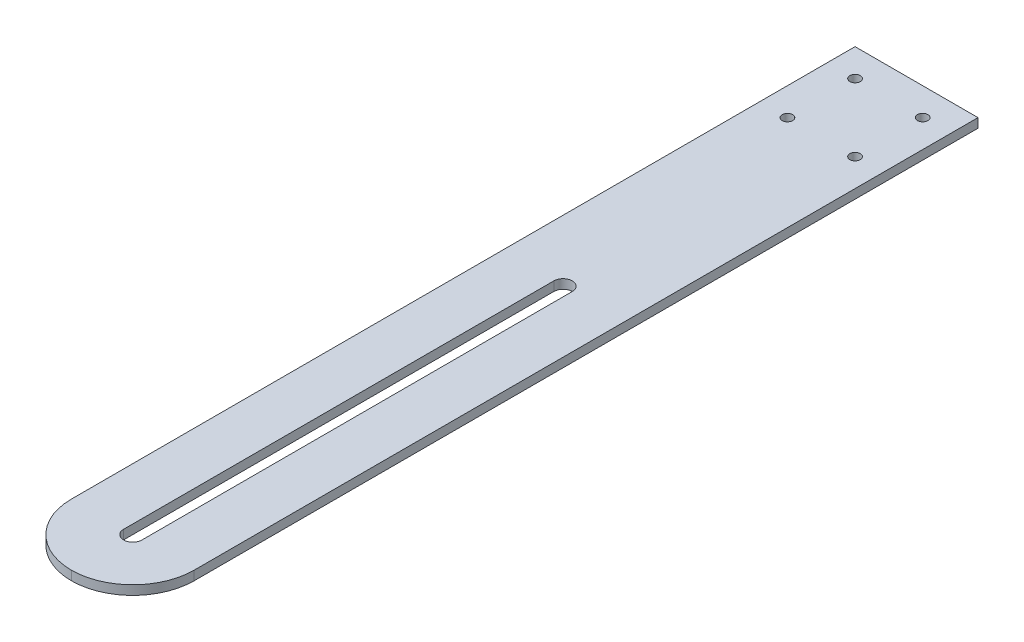
ISO-10303-21;
HEADER;
FILE_DESCRIPTION(('STEP AP214'),'2;1');
FILE_NAME('part.step','',(''),(''),'','','');
FILE_SCHEMA(('AUTOMOTIVE_DESIGN { 1 0 10303 214 1 1 1 1 }'));
ENDSEC;
DATA;
#1=APPLICATION_CONTEXT('core data for automotive mechanical design processes');
#2=APPLICATION_PROTOCOL_DEFINITION('international standard','automotive_design',2000,#1);
#3=PRODUCT_CONTEXT('',#1,'mechanical');
#4=PRODUCT('Part','Part','',(#3));
#5=PRODUCT_RELATED_PRODUCT_CATEGORY('part','',(#4));
#6=PRODUCT_DEFINITION_FORMATION('','',#4);
#7=PRODUCT_DEFINITION_CONTEXT('part definition',#1,'design');
#8=PRODUCT_DEFINITION('design','',#6,#7);
#9=PRODUCT_DEFINITION_SHAPE('','',#8);
#10=(LENGTH_UNIT() NAMED_UNIT(*) SI_UNIT(.MILLI.,.METRE.));
#11=(NAMED_UNIT(*) PLANE_ANGLE_UNIT() SI_UNIT($,.RADIAN.));
#12=(NAMED_UNIT(*) SI_UNIT($,.STERADIAN.) SOLID_ANGLE_UNIT());
#13=UNCERTAINTY_MEASURE_WITH_UNIT(LENGTH_MEASURE(1.E-05),#10,'distance_accuracy_value','');
#14=(GEOMETRIC_REPRESENTATION_CONTEXT(3) GLOBAL_UNCERTAINTY_ASSIGNED_CONTEXT((#13)) GLOBAL_UNIT_ASSIGNED_CONTEXT((#10,
#11,#12)) REPRESENTATION_CONTEXT('',''));
#15=CARTESIAN_POINT('',(0.,0.,0.));
#16=DIRECTION('',(0.,0.,1.));
#17=DIRECTION('',(1.,0.,0.));
#18=AXIS2_PLACEMENT_3D('',#15,#16,#17);
#19=CARTESIAN_POINT('',(-20.,3.,-137.5));
#20=DIRECTION('',(1.,0.,0.));
#21=DIRECTION('',(0.,0.,-1.));
#22=AXIS2_PLACEMENT_3D('',#19,#20,#21);
#23=PLANE('',#22);
#24=DIRECTION('',(0.,0.,1.));
#25=VECTOR('',#24,1.);
#26=CARTESIAN_POINT('',(-20.,0.,-137.5));
#27=LINE('',#26,#25);
#28=CARTESIAN_POINT('',(-20.,0.,-137.5));
#29=VERTEX_POINT('',#28);
#30=CARTESIAN_POINT('',(-20.,0.,117.5));
#31=VERTEX_POINT('',#30);
#32=EDGE_CURVE('E165',#29,#31,#27,.T.);
#33=ORIENTED_EDGE('',*,*,#32,.T.);
#34=DIRECTION('',(0.,-1.,0.));
#35=VECTOR('',#34,1.);
#36=CARTESIAN_POINT('',(-20.,3.,117.5));
#37=LINE('',#36,#35);
#38=CARTESIAN_POINT('',(-20.,3.,117.5));
#39=VERTEX_POINT('',#38);
#40=EDGE_CURVE('E191',#31,#39,#37,.F.);
#41=ORIENTED_EDGE('',*,*,#40,.T.);
#42=DIRECTION('',(0.,0.,1.));
#43=VECTOR('',#42,1.);
#44=CARTESIAN_POINT('',(-20.,3.,-137.5));
#45=LINE('',#44,#43);
#46=CARTESIAN_POINT('',(-20.,3.,-137.5));
#47=VERTEX_POINT('',#46);
#48=EDGE_CURVE('E168',#47,#39,#45,.T.);
#49=ORIENTED_EDGE('',*,*,#48,.F.);
#50=DIRECTION('',(0.,-1.,0.));
#51=VECTOR('',#50,1.);
#52=CARTESIAN_POINT('',(-20.,3.,-137.5));
#53=LINE('',#52,#51);
#54=EDGE_CURVE('E176',#47,#29,#53,.T.);
#55=ORIENTED_EDGE('',*,*,#54,.T.);
#56=EDGE_LOOP('',(#33,#41,#49,#55));
#57=FACE_BOUND('',#56,.T.);
#58=ADVANCED_FACE('F36',(#57),#23,.F.);
#59=CARTESIAN_POINT('',(20.,3.,-137.5));
#60=DIRECTION('',(-1.,0.,0.));
#61=DIRECTION('',(0.,0.,1.));
#62=AXIS2_PLACEMENT_3D('',#59,#60,#61);
#63=PLANE('',#62);
#64=DIRECTION('',(0.,0.,-1.));
#65=VECTOR('',#64,1.);
#66=CARTESIAN_POINT('',(20.,3.,-137.5));
#67=LINE('',#66,#65);
#68=CARTESIAN_POINT('',(20.,3.,117.5));
#69=VERTEX_POINT('',#68);
#70=CARTESIAN_POINT('',(20.,3.,-137.5));
#71=VERTEX_POINT('',#70);
#72=EDGE_CURVE('E171',#69,#71,#67,.T.);
#73=ORIENTED_EDGE('',*,*,#72,.F.);
#74=DIRECTION('',(0.,-1.,0.));
#75=VECTOR('',#74,1.);
#76=CARTESIAN_POINT('',(20.,3.,117.5));
#77=LINE('',#76,#75);
#78=CARTESIAN_POINT('',(20.,0.,117.5));
#79=VERTEX_POINT('',#78);
#80=EDGE_CURVE('E11',#69,#79,#77,.T.);
#81=ORIENTED_EDGE('',*,*,#80,.T.);
#82=DIRECTION('',(0.,0.,-1.));
#83=VECTOR('',#82,1.);
#84=CARTESIAN_POINT('',(20.,0.,-137.5));
#85=LINE('',#84,#83);
#86=CARTESIAN_POINT('',(20.,0.,-137.5));
#87=VERTEX_POINT('',#86);
#88=EDGE_CURVE('E179',#79,#87,#85,.T.);
#89=ORIENTED_EDGE('',*,*,#88,.T.);
#90=DIRECTION('',(0.,-1.,0.));
#91=VECTOR('',#90,1.);
#92=CARTESIAN_POINT('',(20.,3.,-137.5));
#93=LINE('',#92,#91);
#94=EDGE_CURVE('E184',#71,#87,#93,.T.);
#95=ORIENTED_EDGE('',*,*,#94,.F.);
#96=EDGE_LOOP('',(#73,#81,#89,#95));
#97=FACE_BOUND('',#96,.T.);
#98=ADVANCED_FACE('F221',(#97),#63,.F.);
#99=CARTESIAN_POINT('',(20.,3.,-137.5));
#100=DIRECTION('',(0.,0.,1.));
#101=DIRECTION('',(1.,0.,0.));
#102=AXIS2_PLACEMENT_3D('',#99,#100,#101);
#103=PLANE('',#102);
#104=DIRECTION('',(-1.,0.,0.));
#105=VECTOR('',#104,1.);
#106=CARTESIAN_POINT('',(20.,0.,-137.5));
#107=LINE('',#106,#105);
#108=EDGE_CURVE('E172',#87,#29,#107,.T.);
#109=ORIENTED_EDGE('',*,*,#108,.T.);
#110=ORIENTED_EDGE('',*,*,#54,.F.);
#111=DIRECTION('',(-1.,0.,0.));
#112=VECTOR('',#111,1.);
#113=CARTESIAN_POINT('',(20.,3.,-137.5));
#114=LINE('',#113,#112);
#115=EDGE_CURVE('E174',#71,#47,#114,.T.);
#116=ORIENTED_EDGE('',*,*,#115,.F.);
#117=ORIENTED_EDGE('',*,*,#94,.T.);
#118=EDGE_LOOP('',(#109,#110,#116,#117));
#119=FACE_BOUND('',#118,.T.);
#120=ADVANCED_FACE('F218',(#119),#103,.F.);
#121=CARTESIAN_POINT('',(0.,3.,0.));
#122=DIRECTION('',(0.,-1.,0.));
#123=DIRECTION('',(0.,0.,-1.));
#124=AXIS2_PLACEMENT_3D('',#121,#122,#123);
#125=PLANE('',#124);
#126=DIRECTION('',(0.,0.,1.));
#127=VECTOR('',#126,1.);
#128=CARTESIAN_POINT('',(-3.,3.,-22.5));
#129=LINE('',#128,#127);
#130=CARTESIAN_POINT('',(-3.,3.,-22.5));
#131=VERTEX_POINT('',#130);
#132=CARTESIAN_POINT('',(-3.,3.,117.5));
#133=VERTEX_POINT('',#132);
#134=EDGE_CURVE('E134',#131,#133,#129,.T.);
#135=ORIENTED_EDGE('',*,*,#134,.F.);
#136=CARTESIAN_POINT('',(0.,3.,-22.5));
#137=DIRECTION('',(0.,1.,0.));
#138=DIRECTION('',(0.,0.,-1.));
#139=AXIS2_PLACEMENT_3D('',#136,#137,#138);
#140=CIRCLE('',#139,3.);
#141=CARTESIAN_POINT('',(3.,3.,-22.5));
#142=VERTEX_POINT('',#141);
#143=EDGE_CURVE('E52',#142,#131,#140,.T.);
#144=ORIENTED_EDGE('',*,*,#143,.F.);
#145=DIRECTION('',(0.,0.,-1.));
#146=VECTOR('',#145,1.);
#147=CARTESIAN_POINT('',(3.,3.,-22.5));
#148=LINE('',#147,#146);
#149=CARTESIAN_POINT('',(3.,3.,117.5));
#150=VERTEX_POINT('',#149);
#151=EDGE_CURVE('E125',#150,#142,#148,.T.);
#152=ORIENTED_EDGE('',*,*,#151,.F.);
#153=CARTESIAN_POINT('',(0.,3.,117.5));
#154=DIRECTION('',(0.,1.,0.));
#155=DIRECTION('',(0.,0.,1.));
#156=AXIS2_PLACEMENT_3D('',#153,#154,#155);
#157=CIRCLE('',#156,3.);
#158=EDGE_CURVE('E128',#133,#150,#157,.T.);
#159=ORIENTED_EDGE('',*,*,#158,.F.);
#160=EDGE_LOOP('',(#135,#144,#152,#159));
#161=FACE_BOUND('',#160,.T.);
#162=CARTESIAN_POINT('',(-11.,3.,-106.5));
#163=DIRECTION('',(0.,1.,0.));
#164=DIRECTION('',(0.,0.,1.));
#165=AXIS2_PLACEMENT_3D('',#162,#163,#164);
#166=CIRCLE('',#165,1.70000000000001);
#167=CARTESIAN_POINT('',(-11.,3.,-104.8));
#168=VERTEX_POINT('',#167);
#169=EDGE_CURVE('E154',#168,#168,#166,.T.);
#170=ORIENTED_EDGE('',*,*,#169,.F.);
#171=EDGE_LOOP('',(#170));
#172=FACE_BOUND('',#171,.T.);
#173=CARTESIAN_POINT('',(11.,3.,-128.5));
#174=DIRECTION('',(0.,1.,0.));
#175=DIRECTION('',(0.,0.,1.));
#176=AXIS2_PLACEMENT_3D('',#173,#174,#175);
#177=CIRCLE('',#176,1.70000000000001);
#178=CARTESIAN_POINT('',(11.,3.,-126.8));
#179=VERTEX_POINT('',#178);
#180=EDGE_CURVE('E146',#179,#179,#177,.T.);
#181=ORIENTED_EDGE('',*,*,#180,.F.);
#182=EDGE_LOOP('',(#181));
#183=FACE_BOUND('',#182,.T.);
#184=CARTESIAN_POINT('',(11.,3.,-106.5));
#185=DIRECTION('',(0.,1.,0.));
#186=DIRECTION('',(0.,0.,1.));
#187=AXIS2_PLACEMENT_3D('',#184,#185,#186);
#188=CIRCLE('',#187,1.70000000000001);
#189=CARTESIAN_POINT('',(11.,3.,-104.8));
#190=VERTEX_POINT('',#189);
#191=EDGE_CURVE('E147',#190,#190,#188,.T.);
#192=ORIENTED_EDGE('',*,*,#191,.F.);
#193=EDGE_LOOP('',(#192));
#194=FACE_BOUND('',#193,.T.);
#195=CARTESIAN_POINT('',(-11.,3.,-128.5));
#196=DIRECTION('',(0.,1.,0.));
#197=DIRECTION('',(0.,0.,1.));
#198=AXIS2_PLACEMENT_3D('',#195,#196,#197);
#199=CIRCLE('',#198,1.70000000000001);
#200=CARTESIAN_POINT('',(-11.,3.,-126.8));
#201=VERTEX_POINT('',#200);
#202=EDGE_CURVE('E153',#201,#201,#199,.T.);
#203=ORIENTED_EDGE('',*,*,#202,.F.);
#204=EDGE_LOOP('',(#203));
#205=FACE_BOUND('',#204,.T.);
#206=ORIENTED_EDGE('',*,*,#48,.T.);
#207=CARTESIAN_POINT('',(0.,3.,117.5));
#208=DIRECTION('',(0.,-1.,0.));
#209=DIRECTION('',(0.,0.,-1.));
#210=AXIS2_PLACEMENT_3D('',#207,#208,#209);
#211=CIRCLE('',#210,20.);
#212=CARTESIAN_POINT('',(0.,3.,137.5));
#213=VERTEX_POINT('',#212);
#214=EDGE_CURVE('E45',#39,#213,#211,.F.);
#215=ORIENTED_EDGE('',*,*,#214,.T.);
#216=CARTESIAN_POINT('',(0.,3.,117.5));
#217=DIRECTION('',(0.,-1.,0.));
#218=DIRECTION('',(0.,0.,-1.));
#219=AXIS2_PLACEMENT_3D('',#216,#217,#218);
#220=CIRCLE('',#219,20.);
#221=EDGE_CURVE('E194',#213,#69,#220,.F.);
#222=ORIENTED_EDGE('',*,*,#221,.T.);
#223=ORIENTED_EDGE('',*,*,#72,.T.);
#224=ORIENTED_EDGE('',*,*,#115,.T.);
#225=EDGE_LOOP('',(#206,#215,#222,#223,#224));
#226=FACE_BOUND('',#225,.T.);
#227=ADVANCED_FACE('F198',(#161,#172,#183,#194,#205,#226),#125,.F.);
#228=CARTESIAN_POINT('',(0.,0.,0.));
#229=DIRECTION('',(0.,-1.,0.));
#230=DIRECTION('',(0.,0.,-1.));
#231=AXIS2_PLACEMENT_3D('',#228,#229,#230);
#232=PLANE('',#231);
#233=CARTESIAN_POINT('',(0.,0.,-22.5));
#234=DIRECTION('',(0.,1.,0.));
#235=DIRECTION('',(0.,0.,-1.));
#236=AXIS2_PLACEMENT_3D('',#233,#234,#235);
#237=CIRCLE('',#236,3.);
#238=CARTESIAN_POINT('',(3.,0.,-22.5));
#239=VERTEX_POINT('',#238);
#240=CARTESIAN_POINT('',(-3.,0.,-22.5));
#241=VERTEX_POINT('',#240);
#242=EDGE_CURVE('E109',#239,#241,#237,.T.);
#243=ORIENTED_EDGE('',*,*,#242,.T.);
#244=DIRECTION('',(0.,0.,1.));
#245=VECTOR('',#244,1.);
#246=CARTESIAN_POINT('',(-3.,0.,-22.5));
#247=LINE('',#246,#245);
#248=CARTESIAN_POINT('',(-3.,0.,117.5));
#249=VERTEX_POINT('',#248);
#250=EDGE_CURVE('E118',#241,#249,#247,.T.);
#251=ORIENTED_EDGE('',*,*,#250,.T.);
#252=CARTESIAN_POINT('',(0.,0.,117.5));
#253=DIRECTION('',(0.,1.,0.));
#254=DIRECTION('',(0.,0.,1.));
#255=AXIS2_PLACEMENT_3D('',#252,#253,#254);
#256=CIRCLE('',#255,3.);
#257=CARTESIAN_POINT('',(3.,0.,117.5));
#258=VERTEX_POINT('',#257);
#259=EDGE_CURVE('E60',#249,#258,#256,.T.);
#260=ORIENTED_EDGE('',*,*,#259,.T.);
#261=DIRECTION('',(0.,0.,-1.));
#262=VECTOR('',#261,1.);
#263=CARTESIAN_POINT('',(3.,0.,-22.5));
#264=LINE('',#263,#262);
#265=EDGE_CURVE('E115',#258,#239,#264,.T.);
#266=ORIENTED_EDGE('',*,*,#265,.T.);
#267=EDGE_LOOP('',(#243,#251,#260,#266));
#268=FACE_BOUND('',#267,.T.);
#269=CARTESIAN_POINT('',(-11.,0.,-106.5));
#270=DIRECTION('',(0.,1.,0.));
#271=DIRECTION('',(0.,0.,1.));
#272=AXIS2_PLACEMENT_3D('',#269,#270,#271);
#273=CIRCLE('',#272,1.70000000000001);
#274=CARTESIAN_POINT('',(-11.,0.,-104.8));
#275=VERTEX_POINT('',#274);
#276=EDGE_CURVE('E150',#275,#275,#273,.T.);
#277=ORIENTED_EDGE('',*,*,#276,.T.);
#278=EDGE_LOOP('',(#277));
#279=FACE_BOUND('',#278,.T.);
#280=CARTESIAN_POINT('',(11.,0.,-128.5));
#281=DIRECTION('',(0.,1.,0.));
#282=DIRECTION('',(0.,0.,1.));
#283=AXIS2_PLACEMENT_3D('',#280,#281,#282);
#284=CIRCLE('',#283,1.70000000000001);
#285=CARTESIAN_POINT('',(11.,0.,-126.8));
#286=VERTEX_POINT('',#285);
#287=EDGE_CURVE('E157',#286,#286,#284,.T.);
#288=ORIENTED_EDGE('',*,*,#287,.T.);
#289=EDGE_LOOP('',(#288));
#290=FACE_BOUND('',#289,.T.);
#291=CARTESIAN_POINT('',(11.,0.,-106.5));
#292=DIRECTION('',(0.,1.,0.));
#293=DIRECTION('',(0.,0.,1.));
#294=AXIS2_PLACEMENT_3D('',#291,#292,#293);
#295=CIRCLE('',#294,1.70000000000001);
#296=CARTESIAN_POINT('',(11.,0.,-104.8));
#297=VERTEX_POINT('',#296);
#298=EDGE_CURVE('E143',#297,#297,#295,.T.);
#299=ORIENTED_EDGE('',*,*,#298,.T.);
#300=EDGE_LOOP('',(#299));
#301=FACE_BOUND('',#300,.T.);
#302=CARTESIAN_POINT('',(-11.,0.,-128.5));
#303=DIRECTION('',(0.,1.,0.));
#304=DIRECTION('',(0.,0.,1.));
#305=AXIS2_PLACEMENT_3D('',#302,#303,#304);
#306=CIRCLE('',#305,1.70000000000001);
#307=CARTESIAN_POINT('',(-11.,0.,-126.8));
#308=VERTEX_POINT('',#307);
#309=EDGE_CURVE('E162',#308,#308,#306,.T.);
#310=ORIENTED_EDGE('',*,*,#309,.T.);
#311=EDGE_LOOP('',(#310));
#312=FACE_BOUND('',#311,.T.);
#313=CARTESIAN_POINT('',(0.,0.,117.5));
#314=DIRECTION('',(0.,-1.,0.));
#315=DIRECTION('',(0.,0.,-1.));
#316=AXIS2_PLACEMENT_3D('',#313,#314,#315);
#317=CIRCLE('',#316,20.);
#318=CARTESIAN_POINT('',(0.,0.,137.5));
#319=VERTEX_POINT('',#318);
#320=EDGE_CURVE('E187',#79,#319,#317,.T.);
#321=ORIENTED_EDGE('',*,*,#320,.T.);
#322=CARTESIAN_POINT('',(0.,0.,117.5));
#323=DIRECTION('',(0.,-1.,0.));
#324=DIRECTION('',(0.,0.,-1.));
#325=AXIS2_PLACEMENT_3D('',#322,#323,#324);
#326=CIRCLE('',#325,20.);
#327=EDGE_CURVE('E189',#319,#31,#326,.T.);
#328=ORIENTED_EDGE('',*,*,#327,.T.);
#329=ORIENTED_EDGE('',*,*,#32,.F.);
#330=ORIENTED_EDGE('',*,*,#108,.F.);
#331=ORIENTED_EDGE('',*,*,#88,.F.);
#332=EDGE_LOOP('',(#321,#328,#329,#330,#331));
#333=FACE_BOUND('',#332,.T.);
#334=ADVANCED_FACE('F122',(#268,#279,#290,#301,#312,#333),#232,.T.);
#335=CARTESIAN_POINT('',(-11.,0.,-128.5));
#336=DIRECTION('',(0.,1.,0.));
#337=DIRECTION('',(0.,0.,1.));
#338=AXIS2_PLACEMENT_3D('',#335,#336,#337);
#339=CYLINDRICAL_SURFACE('',#338,1.70000000000001);
#340=ORIENTED_EDGE('',*,*,#309,.F.);
#341=EDGE_LOOP('',(#340));
#342=FACE_BOUND('',#341,.T.);
#343=ORIENTED_EDGE('',*,*,#202,.T.);
#344=EDGE_LOOP('',(#343));
#345=FACE_BOUND('',#344,.T.);
#346=ADVANCED_FACE('F255',(#342,#345),#339,.F.);
#347=CARTESIAN_POINT('',(11.,0.,-106.5));
#348=DIRECTION('',(0.,1.,0.));
#349=DIRECTION('',(0.,0.,1.));
#350=AXIS2_PLACEMENT_3D('',#347,#348,#349);
#351=CYLINDRICAL_SURFACE('',#350,1.70000000000001);
#352=ORIENTED_EDGE('',*,*,#298,.F.);
#353=EDGE_LOOP('',(#352));
#354=FACE_BOUND('',#353,.T.);
#355=ORIENTED_EDGE('',*,*,#191,.T.);
#356=EDGE_LOOP('',(#355));
#357=FACE_BOUND('',#356,.T.);
#358=ADVANCED_FACE('F248',(#354,#357),#351,.F.);
#359=CARTESIAN_POINT('',(11.,0.,-128.5));
#360=DIRECTION('',(0.,1.,0.));
#361=DIRECTION('',(0.,0.,1.));
#362=AXIS2_PLACEMENT_3D('',#359,#360,#361);
#363=CYLINDRICAL_SURFACE('',#362,1.70000000000001);
#364=ORIENTED_EDGE('',*,*,#287,.F.);
#365=EDGE_LOOP('',(#364));
#366=FACE_BOUND('',#365,.T.);
#367=ORIENTED_EDGE('',*,*,#180,.T.);
#368=EDGE_LOOP('',(#367));
#369=FACE_BOUND('',#368,.T.);
#370=ADVANCED_FACE('F242',(#366,#369),#363,.F.);
#371=CARTESIAN_POINT('',(-11.,0.,-106.5));
#372=DIRECTION('',(0.,1.,0.));
#373=DIRECTION('',(0.,0.,1.));
#374=AXIS2_PLACEMENT_3D('',#371,#372,#373);
#375=CYLINDRICAL_SURFACE('',#374,1.70000000000001);
#376=ORIENTED_EDGE('',*,*,#276,.F.);
#377=EDGE_LOOP('',(#376));
#378=FACE_BOUND('',#377,.T.);
#379=ORIENTED_EDGE('',*,*,#169,.T.);
#380=EDGE_LOOP('',(#379));
#381=FACE_BOUND('',#380,.T.);
#382=ADVANCED_FACE('F238',(#378,#381),#375,.F.);
#383=CARTESIAN_POINT('',(0.,3.,117.5));
#384=DIRECTION('',(0.,-1.,0.));
#385=DIRECTION('',(0.,0.,-1.));
#386=AXIS2_PLACEMENT_3D('',#383,#384,#385);
#387=CYLINDRICAL_SURFACE('',#386,20.);
#388=ORIENTED_EDGE('',*,*,#80,.F.);
#389=ORIENTED_EDGE('',*,*,#221,.F.);
#390=DIRECTION('',(0.,-1.,0.));
#391=VECTOR('',#390,1.);
#392=CARTESIAN_POINT('',(0.,3.,137.5));
#393=LINE('',#392,#391);
#394=EDGE_CURVE('E40',#319,#213,#393,.F.);
#395=ORIENTED_EDGE('',*,*,#394,.F.);
#396=ORIENTED_EDGE('',*,*,#320,.F.);
#397=EDGE_LOOP('',(#388,#389,#395,#396));
#398=FACE_BOUND('',#397,.T.);
#399=ADVANCED_FACE('F38',(#398),#387,.T.);
#400=CARTESIAN_POINT('',(0.,3.,117.5));
#401=DIRECTION('',(0.,-1.,0.));
#402=DIRECTION('',(0.,0.,-1.));
#403=AXIS2_PLACEMENT_3D('',#400,#401,#402);
#404=CYLINDRICAL_SURFACE('',#403,20.);
#405=ORIENTED_EDGE('',*,*,#214,.F.);
#406=ORIENTED_EDGE('',*,*,#40,.F.);
#407=ORIENTED_EDGE('',*,*,#327,.F.);
#408=ORIENTED_EDGE('',*,*,#394,.T.);
#409=EDGE_LOOP('',(#405,#406,#407,#408));
#410=FACE_BOUND('',#409,.T.);
#411=ADVANCED_FACE('F209',(#410),#404,.T.);
#412=CARTESIAN_POINT('',(0.,0.,-22.5));
#413=DIRECTION('',(0.,1.,0.));
#414=DIRECTION('',(0.,0.,1.));
#415=AXIS2_PLACEMENT_3D('',#412,#413,#414);
#416=CYLINDRICAL_SURFACE('',#415,3.);
#417=ORIENTED_EDGE('',*,*,#143,.T.);
#418=DIRECTION('',(0.,1.,0.));
#419=VECTOR('',#418,1.);
#420=CARTESIAN_POINT('',(-3.,0.,-22.5));
#421=LINE('',#420,#419);
#422=EDGE_CURVE('E105',#241,#131,#421,.T.);
#423=ORIENTED_EDGE('',*,*,#422,.F.);
#424=ORIENTED_EDGE('',*,*,#242,.F.);
#425=DIRECTION('',(0.,1.,0.));
#426=VECTOR('',#425,1.);
#427=CARTESIAN_POINT('',(3.,0.,-22.5));
#428=LINE('',#427,#426);
#429=EDGE_CURVE('E138',#239,#142,#428,.T.);
#430=ORIENTED_EDGE('',*,*,#429,.T.);
#431=EDGE_LOOP('',(#417,#423,#424,#430));
#432=FACE_BOUND('',#431,.T.);
#433=ADVANCED_FACE('F107',(#432),#416,.F.);
#434=CARTESIAN_POINT('',(3.,0.,-22.5));
#435=DIRECTION('',(1.,0.,0.));
#436=DIRECTION('',(0.,0.,-1.));
#437=AXIS2_PLACEMENT_3D('',#434,#435,#436);
#438=PLANE('',#437);
#439=ORIENTED_EDGE('',*,*,#151,.T.);
#440=ORIENTED_EDGE('',*,*,#429,.F.);
#441=ORIENTED_EDGE('',*,*,#265,.F.);
#442=DIRECTION('',(0.,1.,0.));
#443=VECTOR('',#442,1.);
#444=CARTESIAN_POINT('',(3.,0.,117.5));
#445=LINE('',#444,#443);
#446=EDGE_CURVE('E140',#258,#150,#445,.T.);
#447=ORIENTED_EDGE('',*,*,#446,.T.);
#448=EDGE_LOOP('',(#439,#440,#441,#447));
#449=FACE_BOUND('',#448,.T.);
#450=ADVANCED_FACE('F236',(#449),#438,.F.);
#451=CARTESIAN_POINT('',(0.,0.,117.5));
#452=DIRECTION('',(0.,1.,0.));
#453=DIRECTION('',(0.,0.,1.));
#454=AXIS2_PLACEMENT_3D('',#451,#452,#453);
#455=CYLINDRICAL_SURFACE('',#454,3.);
#456=ORIENTED_EDGE('',*,*,#158,.T.);
#457=ORIENTED_EDGE('',*,*,#446,.F.);
#458=ORIENTED_EDGE('',*,*,#259,.F.);
#459=DIRECTION('',(0.,1.,0.));
#460=VECTOR('',#459,1.);
#461=CARTESIAN_POINT('',(-3.,0.,117.5));
#462=LINE('',#461,#460);
#463=EDGE_CURVE('E114',#249,#133,#462,.T.);
#464=ORIENTED_EDGE('',*,*,#463,.T.);
#465=EDGE_LOOP('',(#456,#457,#458,#464));
#466=FACE_BOUND('',#465,.T.);
#467=ADVANCED_FACE('F333',(#466),#455,.F.);
#468=CARTESIAN_POINT('',(-3.,0.,-22.5));
#469=DIRECTION('',(-1.,0.,0.));
#470=DIRECTION('',(0.,0.,1.));
#471=AXIS2_PLACEMENT_3D('',#468,#469,#470);
#472=PLANE('',#471);
#473=ORIENTED_EDGE('',*,*,#134,.T.);
#474=ORIENTED_EDGE('',*,*,#463,.F.);
#475=ORIENTED_EDGE('',*,*,#250,.F.);
#476=ORIENTED_EDGE('',*,*,#422,.T.);
#477=EDGE_LOOP('',(#473,#474,#475,#476));
#478=FACE_BOUND('',#477,.T.);
#479=ADVANCED_FACE('F119',(#478),#472,.F.);
#480=CLOSED_SHELL('',(#58,#98,#120,#227,#334,#346,#358,#370,#382,#399,#411,#433,#450,#467,#479));
#481=MANIFOLD_SOLID_BREP('B2',#480);
#482=ADVANCED_BREP_SHAPE_REPRESENTATION('',(#18,#481),#14);
#483=SHAPE_DEFINITION_REPRESENTATION(#9,#482);
ENDSEC;
END-ISO-10303-21;
